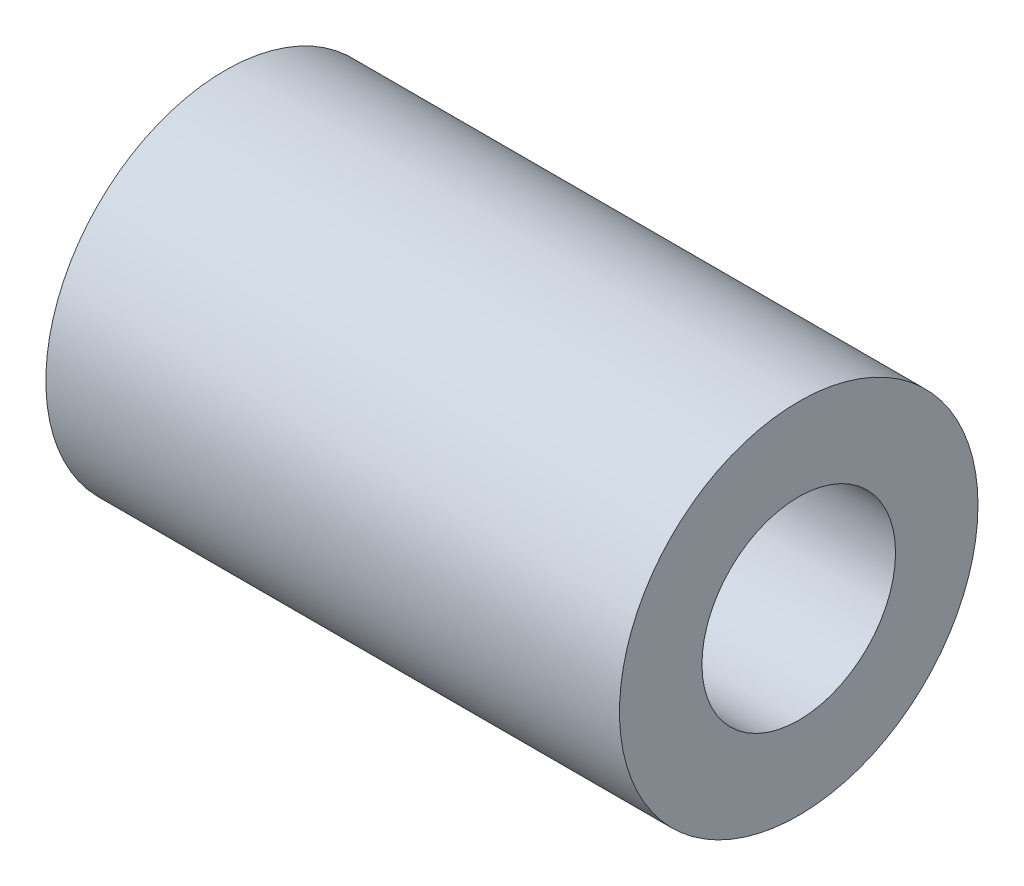
ISO-10303-21;
HEADER;
FILE_DESCRIPTION(('STEP AP214'),'2;1');
FILE_NAME('part.step','',(''),(''),'','','');
FILE_SCHEMA(('AUTOMOTIVE_DESIGN { 1 0 10303 214 1 1 1 1 }'));
ENDSEC;
DATA;
#1=APPLICATION_CONTEXT('core data for automotive mechanical design processes');
#2=APPLICATION_PROTOCOL_DEFINITION('international standard','automotive_design',2000,#1);
#3=PRODUCT_CONTEXT('',#1,'mechanical');
#4=PRODUCT('Part','Part','',(#3));
#5=PRODUCT_RELATED_PRODUCT_CATEGORY('part','',(#4));
#6=PRODUCT_DEFINITION_FORMATION('','',#4);
#7=PRODUCT_DEFINITION_CONTEXT('part definition',#1,'design');
#8=PRODUCT_DEFINITION('design','',#6,#7);
#9=PRODUCT_DEFINITION_SHAPE('','',#8);
#10=(LENGTH_UNIT() NAMED_UNIT(*) SI_UNIT(.MILLI.,.METRE.));
#11=(NAMED_UNIT(*) PLANE_ANGLE_UNIT() SI_UNIT($,.RADIAN.));
#12=(NAMED_UNIT(*) SI_UNIT($,.STERADIAN.) SOLID_ANGLE_UNIT());
#13=UNCERTAINTY_MEASURE_WITH_UNIT(LENGTH_MEASURE(1.E-05),#10,'distance_accuracy_value','');
#14=(GEOMETRIC_REPRESENTATION_CONTEXT(3) GLOBAL_UNCERTAINTY_ASSIGNED_CONTEXT((#13)) GLOBAL_UNIT_ASSIGNED_CONTEXT((#10,
#11,#12)) REPRESENTATION_CONTEXT('',''));
#15=CARTESIAN_POINT('',(0.,0.,0.));
#16=DIRECTION('',(0.,0.,1.));
#17=DIRECTION('',(1.,0.,0.));
#18=AXIS2_PLACEMENT_3D('',#15,#16,#17);
#19=CARTESIAN_POINT('',(24.,0.,0.));
#20=DIRECTION('',(1.,0.,0.));
#21=DIRECTION('',(0.,0.,-1.));
#22=AXIS2_PLACEMENT_3D('',#19,#20,#21);
#23=PLANE('',#22);
#24=CARTESIAN_POINT('',(24.,0.,0.));
#25=DIRECTION('',(1.,0.,0.));
#26=DIRECTION('',(0.,0.,-1.));
#27=AXIS2_PLACEMENT_3D('',#24,#25,#26);
#28=CIRCLE('',#27,7.5);
#29=CARTESIAN_POINT('',(24.,0.,-7.5));
#30=VERTEX_POINT('',#29);
#31=EDGE_CURVE('E10',#30,#30,#28,.T.);
#32=ORIENTED_EDGE('',*,*,#31,.T.);
#33=EDGE_LOOP('',(#32));
#34=FACE_BOUND('',#33,.T.);
#35=CARTESIAN_POINT('',(24.,0.,0.));
#36=DIRECTION('',(1.,0.,0.));
#37=DIRECTION('',(0.,0.,-1.));
#38=AXIS2_PLACEMENT_3D('',#35,#36,#37);
#39=CIRCLE('',#38,4.05);
#40=CARTESIAN_POINT('',(24.,0.,-4.05));
#41=VERTEX_POINT('',#40);
#42=EDGE_CURVE('E44',#41,#41,#39,.T.);
#43=ORIENTED_EDGE('',*,*,#42,.F.);
#44=EDGE_LOOP('',(#43));
#45=FACE_BOUND('',#44,.T.);
#46=ADVANCED_FACE('F33',(#34,#45),#23,.T.);
#47=CARTESIAN_POINT('',(0.,0.,0.));
#48=DIRECTION('',(1.,0.,0.));
#49=DIRECTION('',(0.,0.,-1.));
#50=AXIS2_PLACEMENT_3D('',#47,#48,#49);
#51=PLANE('',#50);
#52=CARTESIAN_POINT('',(0.,0.,0.));
#53=DIRECTION('',(1.,0.,0.));
#54=DIRECTION('',(0.,0.,-1.));
#55=AXIS2_PLACEMENT_3D('',#52,#53,#54);
#56=CIRCLE('',#55,7.5);
#57=CARTESIAN_POINT('',(0.,0.,-7.5));
#58=VERTEX_POINT('',#57);
#59=EDGE_CURVE('E37',#58,#58,#56,.T.);
#60=ORIENTED_EDGE('',*,*,#59,.F.);
#61=EDGE_LOOP('',(#60));
#62=FACE_BOUND('',#61,.T.);
#63=CARTESIAN_POINT('',(0.,0.,0.));
#64=DIRECTION('',(1.,0.,0.));
#65=DIRECTION('',(0.,0.,-1.));
#66=AXIS2_PLACEMENT_3D('',#63,#64,#65);
#67=CIRCLE('',#66,4.05);
#68=CARTESIAN_POINT('',(0.,0.,-4.05));
#69=VERTEX_POINT('',#68);
#70=EDGE_CURVE('E46',#69,#69,#67,.T.);
#71=ORIENTED_EDGE('',*,*,#70,.T.);
#72=EDGE_LOOP('',(#71));
#73=FACE_BOUND('',#72,.T.);
#74=ADVANCED_FACE('F56',(#62,#73),#51,.F.);
#75=CARTESIAN_POINT('',(24.,0.,0.));
#76=DIRECTION('',(-1.,0.,0.));
#77=DIRECTION('',(0.,0.,1.));
#78=AXIS2_PLACEMENT_3D('',#75,#76,#77);
#79=CYLINDRICAL_SURFACE('',#78,7.5);
#80=ORIENTED_EDGE('',*,*,#31,.F.);
#81=EDGE_LOOP('',(#80));
#82=FACE_BOUND('',#81,.T.);
#83=ORIENTED_EDGE('',*,*,#59,.T.);
#84=EDGE_LOOP('',(#83));
#85=FACE_BOUND('',#84,.T.);
#86=ADVANCED_FACE('F35',(#82,#85),#79,.T.);
#87=CARTESIAN_POINT('',(24.,0.,0.));
#88=DIRECTION('',(-1.,0.,0.));
#89=DIRECTION('',(0.,0.,1.));
#90=AXIS2_PLACEMENT_3D('',#87,#88,#89);
#91=CYLINDRICAL_SURFACE('',#90,4.05);
#92=ORIENTED_EDGE('',*,*,#42,.T.);
#93=EDGE_LOOP('',(#92));
#94=FACE_BOUND('',#93,.T.);
#95=ORIENTED_EDGE('',*,*,#70,.F.);
#96=EDGE_LOOP('',(#95));
#97=FACE_BOUND('',#96,.T.);
#98=ADVANCED_FACE('F52',(#94,#97),#91,.F.);
#99=CLOSED_SHELL('',(#46,#74,#86,#98));
#100=MANIFOLD_SOLID_BREP('B2',#99);
#101=ADVANCED_BREP_SHAPE_REPRESENTATION('',(#18,#100),#14);
#102=SHAPE_DEFINITION_REPRESENTATION(#9,#101);
ENDSEC;
END-ISO-10303-21;
